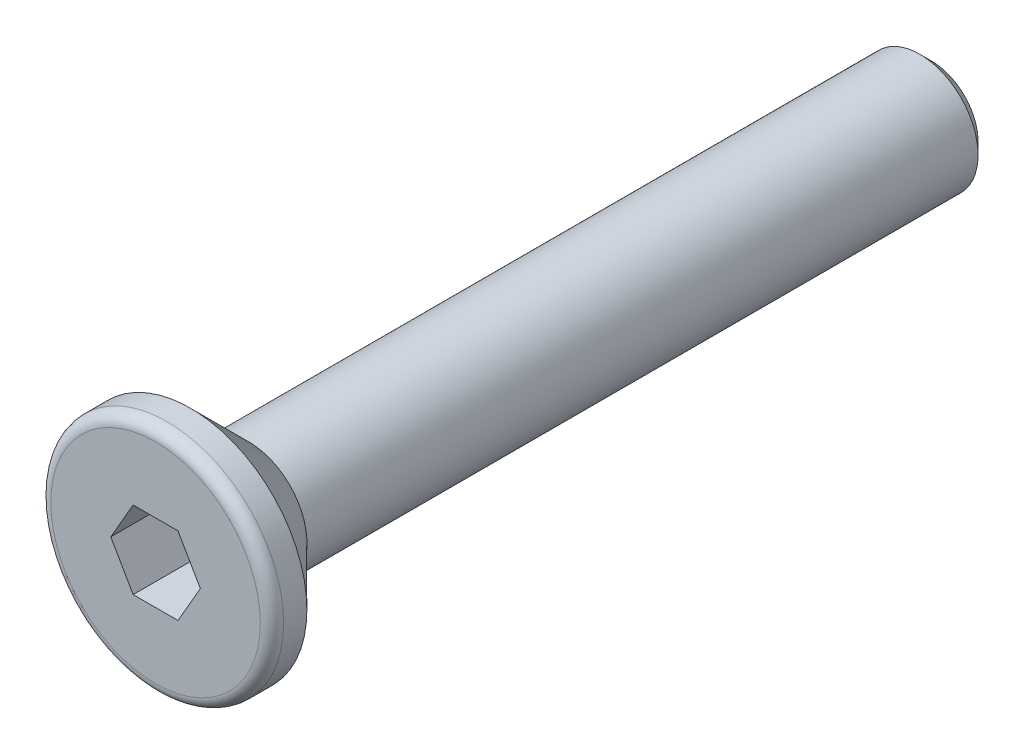
ISO-10303-21;
HEADER;
FILE_DESCRIPTION(('STEP AP214'),'2;1');
FILE_NAME('part.step','',(''),(''),'','','');
FILE_SCHEMA(('AUTOMOTIVE_DESIGN { 1 0 10303 214 1 1 1 1 }'));
ENDSEC;
DATA;
#1=APPLICATION_CONTEXT('core data for automotive mechanical design processes');
#2=APPLICATION_PROTOCOL_DEFINITION('international standard','automotive_design',2000,#1);
#3=PRODUCT_CONTEXT('',#1,'mechanical');
#4=PRODUCT('Part','Part','',(#3));
#5=PRODUCT_RELATED_PRODUCT_CATEGORY('part','',(#4));
#6=PRODUCT_DEFINITION_FORMATION('','',#4);
#7=PRODUCT_DEFINITION_CONTEXT('part definition',#1,'design');
#8=PRODUCT_DEFINITION('design','',#6,#7);
#9=PRODUCT_DEFINITION_SHAPE('','',#8);
#10=(LENGTH_UNIT() NAMED_UNIT(*) SI_UNIT(.MILLI.,.METRE.));
#11=(NAMED_UNIT(*) PLANE_ANGLE_UNIT() SI_UNIT($,.RADIAN.));
#12=(NAMED_UNIT(*) SI_UNIT($,.STERADIAN.) SOLID_ANGLE_UNIT());
#13=UNCERTAINTY_MEASURE_WITH_UNIT(LENGTH_MEASURE(1.E-05),#10,'distance_accuracy_value','');
#14=(GEOMETRIC_REPRESENTATION_CONTEXT(3) GLOBAL_UNCERTAINTY_ASSIGNED_CONTEXT((#13)) GLOBAL_UNIT_ASSIGNED_CONTEXT((#10,
#11,#12)) REPRESENTATION_CONTEXT('',''));
#15=CARTESIAN_POINT('',(0.,0.,0.));
#16=DIRECTION('',(0.,0.,1.));
#17=DIRECTION('',(1.,0.,0.));
#18=AXIS2_PLACEMENT_3D('',#15,#16,#17);
#19=CARTESIAN_POINT('',(0.,0.,10.));
#20=DIRECTION('',(0.,0.,1.));
#21=DIRECTION('',(1.,0.,0.));
#22=AXIS2_PLACEMENT_3D('',#19,#20,#21);
#23=PLANE('',#22);
#24=CARTESIAN_POINT('',(0.,0.,10.));
#25=DIRECTION('',(0.,0.,1.));
#26=DIRECTION('',(1.,0.,0.));
#27=AXIS2_PLACEMENT_3D('',#24,#25,#26);
#28=CIRCLE('',#27,2.7);
#29=CARTESIAN_POINT('',(2.7,0.,10.));
#30=VERTEX_POINT('',#29);
#31=EDGE_CURVE('E11',#30,#30,#28,.T.);
#32=ORIENTED_EDGE('',*,*,#31,.T.);
#33=EDGE_LOOP('',(#32));
#34=FACE_BOUND('',#33,.T.);
#35=DIRECTION('',(0.5,0.866025403784439,0.));
#36=VECTOR('',#35,1.);
#37=CARTESIAN_POINT('',(0.577350269189626,-1.,10.));
#38=LINE('',#37,#36);
#39=CARTESIAN_POINT('',(0.577350269189626,-1.,10.));
#40=VERTEX_POINT('',#39);
#41=CARTESIAN_POINT('',(1.15470053837925,0.,10.));
#42=VERTEX_POINT('',#41);
#43=EDGE_CURVE('E48',#40,#42,#38,.T.);
#44=ORIENTED_EDGE('',*,*,#43,.F.);
#45=DIRECTION('',(1.,0.,0.));
#46=VECTOR('',#45,1.);
#47=CARTESIAN_POINT('',(-0.577350269189626,-1.,10.));
#48=LINE('',#47,#46);
#49=CARTESIAN_POINT('',(-0.577350269189626,-1.,10.));
#50=VERTEX_POINT('',#49);
#51=EDGE_CURVE('E131',#50,#40,#48,.T.);
#52=ORIENTED_EDGE('',*,*,#51,.F.);
#53=DIRECTION('',(0.5,-0.866025403784438,0.));
#54=VECTOR('',#53,1.);
#55=CARTESIAN_POINT('',(-1.15470053837925,0.,10.));
#56=LINE('',#55,#54);
#57=CARTESIAN_POINT('',(-1.15470053837925,0.,10.));
#58=VERTEX_POINT('',#57);
#59=EDGE_CURVE('E129',#58,#50,#56,.T.);
#60=ORIENTED_EDGE('',*,*,#59,.F.);
#61=DIRECTION('',(-0.5,-0.866025403784439,0.));
#62=VECTOR('',#61,1.);
#63=CARTESIAN_POINT('',(-0.577350269189626,1.,10.));
#64=LINE('',#63,#62);
#65=CARTESIAN_POINT('',(-0.577350269189626,1.,10.));
#66=VERTEX_POINT('',#65);
#67=EDGE_CURVE('E96',#66,#58,#64,.T.);
#68=ORIENTED_EDGE('',*,*,#67,.F.);
#69=DIRECTION('',(-1.,0.,0.));
#70=VECTOR('',#69,1.);
#71=CARTESIAN_POINT('',(0.577350269189626,1.,10.));
#72=LINE('',#71,#70);
#73=CARTESIAN_POINT('',(0.577350269189626,1.,10.));
#74=VERTEX_POINT('',#73);
#75=EDGE_CURVE('E125',#74,#66,#72,.T.);
#76=ORIENTED_EDGE('',*,*,#75,.F.);
#77=DIRECTION('',(-0.5,0.866025403784438,0.));
#78=VECTOR('',#77,1.);
#79=CARTESIAN_POINT('',(1.15470053837925,0.,10.));
#80=LINE('',#79,#78);
#81=EDGE_CURVE('E122',#42,#74,#80,.T.);
#82=ORIENTED_EDGE('',*,*,#81,.F.);
#83=EDGE_LOOP('',(#44,#52,#60,#68,#76,#82));
#84=FACE_BOUND('',#83,.T.);
#85=ADVANCED_FACE('F33',(#34,#84),#23,.T.);
#86=CARTESIAN_POINT('',(0.,0.,-10.));
#87=DIRECTION('',(0.,0.,-1.));
#88=DIRECTION('',(-1.,0.,0.));
#89=AXIS2_PLACEMENT_3D('',#86,#87,#88);
#90=CYLINDRICAL_SURFACE('',#89,3.);
#91=CARTESIAN_POINT('',(0.,0.,9.7));
#92=DIRECTION('',(0.,0.,1.));
#93=DIRECTION('',(1.,0.,0.));
#94=AXIS2_PLACEMENT_3D('',#91,#92,#93);
#95=CIRCLE('',#94,3.);
#96=CARTESIAN_POINT('',(3.,0.,9.7));
#97=VERTEX_POINT('',#96);
#98=EDGE_CURVE('E41',#97,#97,#95,.F.);
#99=ORIENTED_EDGE('',*,*,#98,.T.);
#100=EDGE_LOOP('',(#99));
#101=FACE_BOUND('',#100,.T.);
#102=CARTESIAN_POINT('',(0.,0.,9.10000000000002));
#103=DIRECTION('',(0.,0.,-1.));
#104=DIRECTION('',(-1.,0.,0.));
#105=AXIS2_PLACEMENT_3D('',#102,#103,#104);
#106=CIRCLE('',#105,3.);
#107=CARTESIAN_POINT('',(-3.,0.,9.10000000000002));
#108=VERTEX_POINT('',#107);
#109=EDGE_CURVE('E149',#108,#108,#106,.T.);
#110=ORIENTED_EDGE('',*,*,#109,.F.);
#111=EDGE_LOOP('',(#110));
#112=FACE_BOUND('',#111,.T.);
#113=ADVANCED_FACE('F154',(#101,#112),#90,.T.);
#114=CARTESIAN_POINT('',(0.,0.,7.6));
#115=DIRECTION('',(0.,0.,1.));
#116=DIRECTION('',(1.,0.,0.));
#117=AXIS2_PLACEMENT_3D('',#114,#115,#116);
#118=CONICAL_SURFACE('',#117,1.5,0.785398163397442);
#119=ORIENTED_EDGE('',*,*,#109,.T.);
#120=EDGE_LOOP('',(#119));
#121=FACE_BOUND('',#120,.T.);
#122=CARTESIAN_POINT('',(0.,0.,7.6));
#123=DIRECTION('',(0.,0.,-1.));
#124=DIRECTION('',(-1.,0.,0.));
#125=AXIS2_PLACEMENT_3D('',#122,#123,#124);
#126=CIRCLE('',#125,1.5);
#127=CARTESIAN_POINT('',(-1.5,0.,7.6));
#128=VERTEX_POINT('',#127);
#129=EDGE_CURVE('E146',#128,#128,#126,.T.);
#130=ORIENTED_EDGE('',*,*,#129,.F.);
#131=EDGE_LOOP('',(#130));
#132=FACE_BOUND('',#131,.T.);
#133=ADVANCED_FACE('F170',(#121,#132),#118,.T.);
#134=CARTESIAN_POINT('',(0.,0.,-10.));
#135=DIRECTION('',(0.,0.,-1.));
#136=DIRECTION('',(-1.,0.,0.));
#137=AXIS2_PLACEMENT_3D('',#134,#135,#136);
#138=CYLINDRICAL_SURFACE('',#137,1.5);
#139=ORIENTED_EDGE('',*,*,#129,.T.);
#140=EDGE_LOOP('',(#139));
#141=FACE_BOUND('',#140,.T.);
#142=CARTESIAN_POINT('',(0.,0.,-9.7));
#143=DIRECTION('',(0.,0.,-1.));
#144=DIRECTION('',(-1.,0.,0.));
#145=AXIS2_PLACEMENT_3D('',#142,#143,#144);
#146=CIRCLE('',#145,1.5);
#147=CARTESIAN_POINT('',(-1.5,0.,-9.7));
#148=VERTEX_POINT('',#147);
#149=EDGE_CURVE('E143',#148,#148,#146,.T.);
#150=ORIENTED_EDGE('',*,*,#149,.F.);
#151=EDGE_LOOP('',(#150));
#152=FACE_BOUND('',#151,.T.);
#153=ADVANCED_FACE('F176',(#141,#152),#138,.T.);
#154=CARTESIAN_POINT('',(0.,0.,-10.));
#155=DIRECTION('',(0.,0.,1.));
#156=DIRECTION('',(1.,0.,0.));
#157=AXIS2_PLACEMENT_3D('',#154,#155,#156);
#158=CONICAL_SURFACE('',#157,1.2,0.785398163397445);
#159=ORIENTED_EDGE('',*,*,#149,.T.);
#160=EDGE_LOOP('',(#159));
#161=FACE_BOUND('',#160,.T.);
#162=CARTESIAN_POINT('',(0.,0.,-10.));
#163=DIRECTION('',(0.,0.,-1.));
#164=DIRECTION('',(-1.,0.,0.));
#165=AXIS2_PLACEMENT_3D('',#162,#163,#164);
#166=CIRCLE('',#165,1.2);
#167=CARTESIAN_POINT('',(-1.2,0.,-10.));
#168=VERTEX_POINT('',#167);
#169=EDGE_CURVE('E135',#168,#168,#166,.T.);
#170=ORIENTED_EDGE('',*,*,#169,.F.);
#171=EDGE_LOOP('',(#170));
#172=FACE_BOUND('',#171,.T.);
#173=ADVANCED_FACE('F180',(#161,#172),#158,.T.);
#174=CARTESIAN_POINT('',(0.,1.2,-10.));
#175=DIRECTION('',(0.,0.,-1.));
#176=DIRECTION('',(-1.,0.,0.));
#177=AXIS2_PLACEMENT_3D('',#174,#175,#176);
#178=PLANE('',#177);
#179=ORIENTED_EDGE('',*,*,#169,.T.);
#180=EDGE_LOOP('',(#179));
#181=FACE_BOUND('',#180,.T.);
#182=ADVANCED_FACE('F184',(#181),#178,.T.);
#183=CARTESIAN_POINT('',(0.577350269189626,-1.,8.5));
#184=DIRECTION('',(0.866025403784438,-0.5,0.));
#185=DIRECTION('',(0.5,0.866025403784439,0.));
#186=AXIS2_PLACEMENT_3D('',#183,#184,#185);
#187=PLANE('',#186);
#188=ORIENTED_EDGE('',*,*,#43,.T.);
#189=DIRECTION('',(0.,0.,1.));
#190=VECTOR('',#189,1.);
#191=CARTESIAN_POINT('',(1.15470053837925,0.,8.5));
#192=LINE('',#191,#190);
#193=CARTESIAN_POINT('',(1.15470053837925,0.,8.5));
#194=VERTEX_POINT('',#193);
#195=EDGE_CURVE('E78',#194,#42,#192,.T.);
#196=ORIENTED_EDGE('',*,*,#195,.F.);
#197=DIRECTION('',(0.5,0.866025403784439,0.));
#198=VECTOR('',#197,1.);
#199=CARTESIAN_POINT('',(0.577350269189626,-1.,8.5));
#200=LINE('',#199,#198);
#201=CARTESIAN_POINT('',(0.577350269189626,-1.,8.5));
#202=VERTEX_POINT('',#201);
#203=EDGE_CURVE('E133',#202,#194,#200,.T.);
#204=ORIENTED_EDGE('',*,*,#203,.F.);
#205=DIRECTION('',(0.,0.,1.));
#206=VECTOR('',#205,1.);
#207=CARTESIAN_POINT('',(0.577350269189626,-1.,8.5));
#208=LINE('',#207,#206);
#209=EDGE_CURVE('E56',#202,#40,#208,.T.);
#210=ORIENTED_EDGE('',*,*,#209,.T.);
#211=EDGE_LOOP('',(#188,#196,#204,#210));
#212=FACE_BOUND('',#211,.T.);
#213=ADVANCED_FACE('F188',(#212),#187,.F.);
#214=CARTESIAN_POINT('',(-0.577350269189626,-1.,8.5));
#215=DIRECTION('',(0.,-1.,0.));
#216=DIRECTION('',(1.,0.,0.));
#217=AXIS2_PLACEMENT_3D('',#214,#215,#216);
#218=PLANE('',#217);
#219=ORIENTED_EDGE('',*,*,#51,.T.);
#220=ORIENTED_EDGE('',*,*,#209,.F.);
#221=DIRECTION('',(1.,0.,0.));
#222=VECTOR('',#221,1.);
#223=CARTESIAN_POINT('',(-0.577350269189626,-1.,8.5));
#224=LINE('',#223,#222);
#225=CARTESIAN_POINT('',(-0.577350269189626,-1.,8.5));
#226=VERTEX_POINT('',#225);
#227=EDGE_CURVE('E108',#226,#202,#224,.T.);
#228=ORIENTED_EDGE('',*,*,#227,.F.);
#229=DIRECTION('',(0.,0.,1.));
#230=VECTOR('',#229,1.);
#231=CARTESIAN_POINT('',(-0.577350269189626,-1.,8.5));
#232=LINE('',#231,#230);
#233=EDGE_CURVE('E100',#226,#50,#232,.T.);
#234=ORIENTED_EDGE('',*,*,#233,.T.);
#235=EDGE_LOOP('',(#219,#220,#228,#234));
#236=FACE_BOUND('',#235,.T.);
#237=ADVANCED_FACE('F192',(#236),#218,.F.);
#238=CARTESIAN_POINT('',(-1.15470053837925,0.,8.5));
#239=DIRECTION('',(-0.866025403784439,-0.5,0.));
#240=DIRECTION('',(0.5,-0.866025403784439,0.));
#241=AXIS2_PLACEMENT_3D('',#238,#239,#240);
#242=PLANE('',#241);
#243=ORIENTED_EDGE('',*,*,#59,.T.);
#244=ORIENTED_EDGE('',*,*,#233,.F.);
#245=DIRECTION('',(0.5,-0.866025403784438,0.));
#246=VECTOR('',#245,1.);
#247=CARTESIAN_POINT('',(-1.15470053837925,0.,8.5));
#248=LINE('',#247,#246);
#249=CARTESIAN_POINT('',(-1.15470053837925,0.,8.5));
#250=VERTEX_POINT('',#249);
#251=EDGE_CURVE('E104',#250,#226,#248,.T.);
#252=ORIENTED_EDGE('',*,*,#251,.F.);
#253=DIRECTION('',(0.,0.,1.));
#254=VECTOR('',#253,1.);
#255=CARTESIAN_POINT('',(-1.15470053837925,0.,8.5));
#256=LINE('',#255,#254);
#257=EDGE_CURVE('E89',#250,#58,#256,.T.);
#258=ORIENTED_EDGE('',*,*,#257,.T.);
#259=EDGE_LOOP('',(#243,#244,#252,#258));
#260=FACE_BOUND('',#259,.T.);
#261=ADVANCED_FACE('F105',(#260),#242,.F.);
#262=CARTESIAN_POINT('',(-0.577350269189626,1.,8.5));
#263=DIRECTION('',(-0.866025403784439,0.5,0.));
#264=DIRECTION('',(-0.5,-0.866025403784439,0.));
#265=AXIS2_PLACEMENT_3D('',#262,#263,#264);
#266=PLANE('',#265);
#267=ORIENTED_EDGE('',*,*,#67,.T.);
#268=ORIENTED_EDGE('',*,*,#257,.F.);
#269=DIRECTION('',(-0.5,-0.866025403784439,0.));
#270=VECTOR('',#269,1.);
#271=CARTESIAN_POINT('',(-0.577350269189626,1.,8.5));
#272=LINE('',#271,#270);
#273=CARTESIAN_POINT('',(-0.577350269189626,1.,8.5));
#274=VERTEX_POINT('',#273);
#275=EDGE_CURVE('E93',#274,#250,#272,.T.);
#276=ORIENTED_EDGE('',*,*,#275,.F.);
#277=DIRECTION('',(0.,0.,1.));
#278=VECTOR('',#277,1.);
#279=CARTESIAN_POINT('',(-0.577350269189626,1.,8.5));
#280=LINE('',#279,#278);
#281=EDGE_CURVE('E101',#274,#66,#280,.T.);
#282=ORIENTED_EDGE('',*,*,#281,.T.);
#283=EDGE_LOOP('',(#267,#268,#276,#282));
#284=FACE_BOUND('',#283,.T.);
#285=ADVANCED_FACE('F91',(#284),#266,.F.);
#286=CARTESIAN_POINT('',(0.577350269189626,1.,8.5));
#287=DIRECTION('',(0.,1.,0.));
#288=DIRECTION('',(-1.,0.,0.));
#289=AXIS2_PLACEMENT_3D('',#286,#287,#288);
#290=PLANE('',#289);
#291=ORIENTED_EDGE('',*,*,#75,.T.);
#292=ORIENTED_EDGE('',*,*,#281,.F.);
#293=DIRECTION('',(-1.,0.,0.));
#294=VECTOR('',#293,1.);
#295=CARTESIAN_POINT('',(0.577350269189626,1.,8.5));
#296=LINE('',#295,#294);
#297=CARTESIAN_POINT('',(0.577350269189626,1.,8.5));
#298=VERTEX_POINT('',#297);
#299=EDGE_CURVE('E114',#298,#274,#296,.T.);
#300=ORIENTED_EDGE('',*,*,#299,.F.);
#301=DIRECTION('',(0.,0.,1.));
#302=VECTOR('',#301,1.);
#303=CARTESIAN_POINT('',(0.577350269189626,1.,8.5));
#304=LINE('',#303,#302);
#305=EDGE_CURVE('E138',#298,#74,#304,.T.);
#306=ORIENTED_EDGE('',*,*,#305,.T.);
#307=EDGE_LOOP('',(#291,#292,#300,#306));
#308=FACE_BOUND('',#307,.T.);
#309=ADVANCED_FACE('F195',(#308),#290,.F.);
#310=CARTESIAN_POINT('',(1.15470053837925,0.,8.5));
#311=DIRECTION('',(0.866025403784439,0.5,0.));
#312=DIRECTION('',(-0.5,0.866025403784439,0.));
#313=AXIS2_PLACEMENT_3D('',#310,#311,#312);
#314=PLANE('',#313);
#315=ORIENTED_EDGE('',*,*,#81,.T.);
#316=ORIENTED_EDGE('',*,*,#305,.F.);
#317=DIRECTION('',(-0.5,0.866025403784438,0.));
#318=VECTOR('',#317,1.);
#319=CARTESIAN_POINT('',(1.15470053837925,0.,8.5));
#320=LINE('',#319,#318);
#321=EDGE_CURVE('E116',#194,#298,#320,.T.);
#322=ORIENTED_EDGE('',*,*,#321,.F.);
#323=ORIENTED_EDGE('',*,*,#195,.T.);
#324=EDGE_LOOP('',(#315,#316,#322,#323));
#325=FACE_BOUND('',#324,.T.);
#326=ADVANCED_FACE('F162',(#325),#314,.F.);
#327=CARTESIAN_POINT('',(0.,0.,8.5));
#328=DIRECTION('',(0.,0.,1.));
#329=DIRECTION('',(1.,0.,0.));
#330=AXIS2_PLACEMENT_3D('',#327,#328,#329);
#331=PLANE('',#330);
#332=ORIENTED_EDGE('',*,*,#203,.T.);
#333=ORIENTED_EDGE('',*,*,#321,.T.);
#334=ORIENTED_EDGE('',*,*,#299,.T.);
#335=ORIENTED_EDGE('',*,*,#275,.T.);
#336=ORIENTED_EDGE('',*,*,#251,.T.);
#337=ORIENTED_EDGE('',*,*,#227,.T.);
#338=EDGE_LOOP('',(#332,#333,#334,#335,#336,#337));
#339=FACE_BOUND('',#338,.T.);
#340=ADVANCED_FACE('F111',(#339),#331,.T.);
#341=CARTESIAN_POINT('',(0.,0.,9.7));
#342=DIRECTION('',(0.,0.,1.));
#343=DIRECTION('',(1.,0.,0.));
#344=AXIS2_PLACEMENT_3D('',#341,#342,#343);
#345=TOROIDAL_SURFACE('',#344,2.7,0.3);
#346=ORIENTED_EDGE('',*,*,#31,.F.);
#347=EDGE_LOOP('',(#346));
#348=FACE_BOUND('',#347,.T.);
#349=ORIENTED_EDGE('',*,*,#98,.F.);
#350=EDGE_LOOP('',(#349));
#351=FACE_BOUND('',#350,.T.);
#352=ADVANCED_FACE('F35',(#348,#351),#345,.T.);
#353=CLOSED_SHELL('',(#85,#113,#133,#153,#173,#182,#213,#237,#261,#285,#309,#326,#340,#352));
#354=MANIFOLD_SOLID_BREP('B2',#353);
#355=ADVANCED_BREP_SHAPE_REPRESENTATION('',(#18,#354),#14);
#356=SHAPE_DEFINITION_REPRESENTATION(#9,#355);
ENDSEC;
END-ISO-10303-21;
